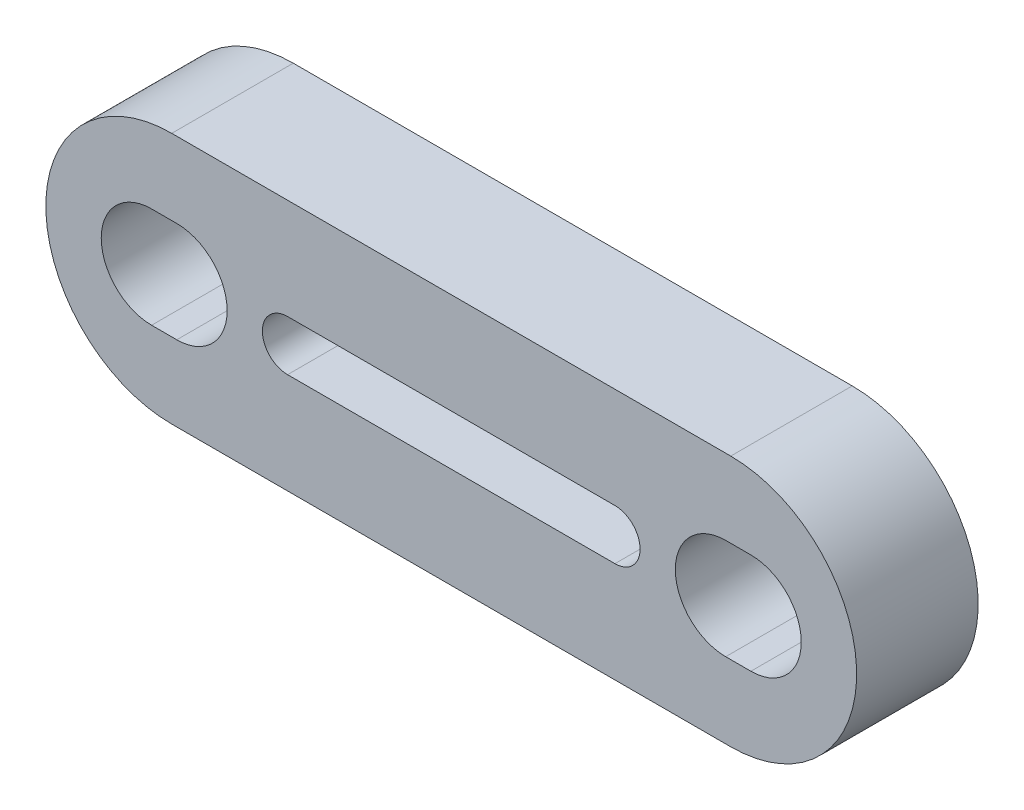
ISO-10303-21;
HEADER;
FILE_DESCRIPTION(('STEP AP214'),'2;1');
FILE_NAME('part.step','',(''),(''),'','','');
FILE_SCHEMA(('AUTOMOTIVE_DESIGN { 1 0 10303 214 1 1 1 1 }'));
ENDSEC;
DATA;
#1=APPLICATION_CONTEXT('core data for automotive mechanical design processes');
#2=APPLICATION_PROTOCOL_DEFINITION('international standard','automotive_design',2000,#1);
#3=PRODUCT_CONTEXT('',#1,'mechanical');
#4=PRODUCT('Part','Part','',(#3));
#5=PRODUCT_RELATED_PRODUCT_CATEGORY('part','',(#4));
#6=PRODUCT_DEFINITION_FORMATION('','',#4);
#7=PRODUCT_DEFINITION_CONTEXT('part definition',#1,'design');
#8=PRODUCT_DEFINITION('design','',#6,#7);
#9=PRODUCT_DEFINITION_SHAPE('','',#8);
#10=(LENGTH_UNIT() NAMED_UNIT(*) SI_UNIT(.MILLI.,.METRE.));
#11=(NAMED_UNIT(*) PLANE_ANGLE_UNIT() SI_UNIT($,.RADIAN.));
#12=(NAMED_UNIT(*) SI_UNIT($,.STERADIAN.) SOLID_ANGLE_UNIT());
#13=UNCERTAINTY_MEASURE_WITH_UNIT(LENGTH_MEASURE(1.E-05),#10,'distance_accuracy_value','');
#14=(GEOMETRIC_REPRESENTATION_CONTEXT(3) GLOBAL_UNCERTAINTY_ASSIGNED_CONTEXT((#13)) GLOBAL_UNIT_ASSIGNED_CONTEXT((#10,
#11,#12)) REPRESENTATION_CONTEXT('',''));
#15=CARTESIAN_POINT('',(0.,0.,0.));
#16=DIRECTION('',(0.,0.,1.));
#17=DIRECTION('',(1.,0.,0.));
#18=AXIS2_PLACEMENT_3D('',#15,#16,#17);
#19=CARTESIAN_POINT('',(0.,-5.,-1.651));
#20=DIRECTION('',(0.,-1.,0.));
#21=DIRECTION('',(0.,0.,-1.));
#22=AXIS2_PLACEMENT_3D('',#19,#20,#21);
#23=PLANE('',#22);
#24=DIRECTION('',(0.,0.,1.));
#25=VECTOR('',#24,1.);
#26=CARTESIAN_POINT('',(23.,-5.,-1.651));
#27=LINE('',#26,#25);
#28=CARTESIAN_POINT('',(23.,-5.,-1.651));
#29=VERTEX_POINT('',#28);
#30=CARTESIAN_POINT('',(23.,-5.,3.175));
#31=VERTEX_POINT('',#30);
#32=EDGE_CURVE('E251',#29,#31,#27,.T.);
#33=ORIENTED_EDGE('',*,*,#32,.T.);
#34=DIRECTION('',(1.,0.,0.));
#35=VECTOR('',#34,1.);
#36=CARTESIAN_POINT('',(0.,-5.,3.175));
#37=LINE('',#36,#35);
#38=CARTESIAN_POINT('',(0.799999999999999,-5.,3.175));
#39=VERTEX_POINT('',#38);
#40=EDGE_CURVE('E203',#39,#31,#37,.T.);
#41=ORIENTED_EDGE('',*,*,#40,.F.);
#42=DIRECTION('',(0.,0.,1.));
#43=VECTOR('',#42,1.);
#44=CARTESIAN_POINT('',(0.799999999999999,-5.,-1.651));
#45=LINE('',#44,#43);
#46=CARTESIAN_POINT('',(0.799999999999999,-5.,-1.651));
#47=VERTEX_POINT('',#46);
#48=EDGE_CURVE('E11',#47,#39,#45,.T.);
#49=ORIENTED_EDGE('',*,*,#48,.F.);
#50=DIRECTION('',(1.,0.,0.));
#51=VECTOR('',#50,1.);
#52=CARTESIAN_POINT('',(0.,-5.,-1.651));
#53=LINE('',#52,#51);
#54=EDGE_CURVE('E241',#47,#29,#53,.T.);
#55=ORIENTED_EDGE('',*,*,#54,.T.);
#56=EDGE_LOOP('',(#33,#41,#49,#55));
#57=FACE_BOUND('',#56,.T.);
#58=ADVANCED_FACE('F37',(#57),#23,.T.);
#59=CARTESIAN_POINT('',(0.799999999999999,0.,-1.651));
#60=DIRECTION('',(0.,0.,1.));
#61=DIRECTION('',(1.,0.,0.));
#62=AXIS2_PLACEMENT_3D('',#59,#60,#61);
#63=CYLINDRICAL_SURFACE('',#62,5.);
#64=ORIENTED_EDGE('',*,*,#48,.T.);
#65=CARTESIAN_POINT('',(0.799999999999999,0.,3.175));
#66=DIRECTION('',(0.,0.,1.));
#67=DIRECTION('',(1.,0.,0.));
#68=AXIS2_PLACEMENT_3D('',#65,#66,#67);
#69=CIRCLE('',#68,5.);
#70=CARTESIAN_POINT('',(0.799999999999999,5.,3.175));
#71=VERTEX_POINT('',#70);
#72=EDGE_CURVE('E212',#39,#71,#69,.F.);
#73=ORIENTED_EDGE('',*,*,#72,.T.);
#74=DIRECTION('',(0.,0.,1.));
#75=VECTOR('',#74,1.);
#76=CARTESIAN_POINT('',(0.799999999999999,5.,-1.651));
#77=LINE('',#76,#75);
#78=CARTESIAN_POINT('',(0.799999999999999,5.,-1.651));
#79=VERTEX_POINT('',#78);
#80=EDGE_CURVE('E46',#79,#71,#77,.T.);
#81=ORIENTED_EDGE('',*,*,#80,.F.);
#82=CARTESIAN_POINT('',(0.799999999999999,0.,-1.651));
#83=DIRECTION('',(0.,0.,1.));
#84=DIRECTION('',(1.,0.,0.));
#85=AXIS2_PLACEMENT_3D('',#82,#83,#84);
#86=CIRCLE('',#85,5.);
#87=EDGE_CURVE('E160',#47,#79,#86,.F.);
#88=ORIENTED_EDGE('',*,*,#87,.F.);
#89=EDGE_LOOP('',(#64,#73,#81,#88));
#90=FACE_BOUND('',#89,.T.);
#91=ADVANCED_FACE('F301',(#90),#63,.T.);
#92=CARTESIAN_POINT('',(0.,5.,-1.651));
#93=DIRECTION('',(0.,-1.,0.));
#94=DIRECTION('',(0.,0.,-1.));
#95=AXIS2_PLACEMENT_3D('',#92,#93,#94);
#96=PLANE('',#95);
#97=ORIENTED_EDGE('',*,*,#80,.T.);
#98=DIRECTION('',(1.,0.,0.));
#99=VECTOR('',#98,1.);
#100=CARTESIAN_POINT('',(0.,5.,3.175));
#101=LINE('',#100,#99);
#102=CARTESIAN_POINT('',(23.,5.,3.175));
#103=VERTEX_POINT('',#102);
#104=EDGE_CURVE('E209',#71,#103,#101,.T.);
#105=ORIENTED_EDGE('',*,*,#104,.T.);
#106=DIRECTION('',(0.,0.,1.));
#107=VECTOR('',#106,1.);
#108=CARTESIAN_POINT('',(23.,5.,-1.651));
#109=LINE('',#108,#107);
#110=CARTESIAN_POINT('',(23.,5.,-1.651));
#111=VERTEX_POINT('',#110);
#112=EDGE_CURVE('E249',#111,#103,#109,.T.);
#113=ORIENTED_EDGE('',*,*,#112,.F.);
#114=DIRECTION('',(1.,0.,0.));
#115=VECTOR('',#114,1.);
#116=CARTESIAN_POINT('',(0.,5.,-1.651));
#117=LINE('',#116,#115);
#118=EDGE_CURVE('E60',#79,#111,#117,.T.);
#119=ORIENTED_EDGE('',*,*,#118,.F.);
#120=EDGE_LOOP('',(#97,#105,#113,#119));
#121=FACE_BOUND('',#120,.T.);
#122=ADVANCED_FACE('F302',(#121),#96,.F.);
#123=CARTESIAN_POINT('',(5.4,0.,-1.651));
#124=DIRECTION('',(0.,0.,1.));
#125=DIRECTION('',(1.,0.,0.));
#126=AXIS2_PLACEMENT_3D('',#123,#124,#125);
#127=CYLINDRICAL_SURFACE('',#126,0.999999999999997);
#128=DIRECTION('',(0.,0.,1.));
#129=VECTOR('',#128,1.);
#130=CARTESIAN_POINT('',(5.4,0.999999999999998,-1.651));
#131=LINE('',#130,#129);
#132=CARTESIAN_POINT('',(5.4,0.999999999999998,-1.651));
#133=VERTEX_POINT('',#132);
#134=CARTESIAN_POINT('',(5.4,0.999999999999998,3.175));
#135=VERTEX_POINT('',#134);
#136=EDGE_CURVE('E259',#133,#135,#131,.T.);
#137=ORIENTED_EDGE('',*,*,#136,.T.);
#138=CARTESIAN_POINT('',(5.4,0.,3.175));
#139=DIRECTION('',(0.,0.,1.));
#140=DIRECTION('',(1.,0.,0.));
#141=AXIS2_PLACEMENT_3D('',#138,#139,#140);
#142=CIRCLE('',#141,0.999999999999997);
#143=CARTESIAN_POINT('',(5.4,-0.999999999999997,3.175));
#144=VERTEX_POINT('',#143);
#145=EDGE_CURVE('E191',#135,#144,#142,.T.);
#146=ORIENTED_EDGE('',*,*,#145,.T.);
#147=DIRECTION('',(0.,0.,1.));
#148=VECTOR('',#147,1.);
#149=CARTESIAN_POINT('',(5.4,-0.999999999999997,-1.651));
#150=LINE('',#149,#148);
#151=CARTESIAN_POINT('',(5.4,-0.999999999999997,-1.651));
#152=VERTEX_POINT('',#151);
#153=EDGE_CURVE('E253',#152,#144,#150,.T.);
#154=ORIENTED_EDGE('',*,*,#153,.F.);
#155=CARTESIAN_POINT('',(5.4,0.,-1.651));
#156=DIRECTION('',(0.,0.,1.));
#157=DIRECTION('',(1.,0.,0.));
#158=AXIS2_PLACEMENT_3D('',#155,#156,#157);
#159=CIRCLE('',#158,0.999999999999997);
#160=EDGE_CURVE('E232',#133,#152,#159,.T.);
#161=ORIENTED_EDGE('',*,*,#160,.F.);
#162=EDGE_LOOP('',(#137,#146,#154,#161));
#163=FACE_BOUND('',#162,.T.);
#164=ADVANCED_FACE('F304',(#163),#127,.F.);
#165=CARTESIAN_POINT('',(0.,-0.999999999999997,-1.651));
#166=DIRECTION('',(0.,1.,0.));
#167=DIRECTION('',(0.,0.,1.));
#168=AXIS2_PLACEMENT_3D('',#165,#166,#167);
#169=PLANE('',#168);
#170=ORIENTED_EDGE('',*,*,#153,.T.);
#171=DIRECTION('',(-1.,0.,0.));
#172=VECTOR('',#171,1.);
#173=CARTESIAN_POINT('',(0.,-0.999999999999997,3.175));
#174=LINE('',#173,#172);
#175=CARTESIAN_POINT('',(18.4,-0.999999999999997,3.175));
#176=VERTEX_POINT('',#175);
#177=EDGE_CURVE('E200',#176,#144,#174,.T.);
#178=ORIENTED_EDGE('',*,*,#177,.F.);
#179=DIRECTION('',(0.,0.,1.));
#180=VECTOR('',#179,1.);
#181=CARTESIAN_POINT('',(18.4,-0.999999999999997,-1.651));
#182=LINE('',#181,#180);
#183=CARTESIAN_POINT('',(18.4,-0.999999999999997,-1.651));
#184=VERTEX_POINT('',#183);
#185=EDGE_CURVE('E255',#184,#176,#182,.T.);
#186=ORIENTED_EDGE('',*,*,#185,.F.);
#187=DIRECTION('',(-1.,0.,0.));
#188=VECTOR('',#187,1.);
#189=CARTESIAN_POINT('',(0.,-0.999999999999997,-1.651));
#190=LINE('',#189,#188);
#191=EDGE_CURVE('E238',#184,#152,#190,.T.);
#192=ORIENTED_EDGE('',*,*,#191,.T.);
#193=EDGE_LOOP('',(#170,#178,#186,#192));
#194=FACE_BOUND('',#193,.T.);
#195=ADVANCED_FACE('F310',(#194),#169,.T.);
#196=CARTESIAN_POINT('',(18.4,0.,-1.651));
#197=DIRECTION('',(0.,0.,1.));
#198=DIRECTION('',(1.,0.,0.));
#199=AXIS2_PLACEMENT_3D('',#196,#197,#198);
#200=CYLINDRICAL_SURFACE('',#199,0.999999999999997);
#201=ORIENTED_EDGE('',*,*,#185,.T.);
#202=CARTESIAN_POINT('',(18.4,0.,3.175));
#203=DIRECTION('',(0.,0.,1.));
#204=DIRECTION('',(1.,0.,0.));
#205=AXIS2_PLACEMENT_3D('',#202,#203,#204);
#206=CIRCLE('',#205,0.999999999999997);
#207=CARTESIAN_POINT('',(18.4,0.999999999999999,3.175));
#208=VERTEX_POINT('',#207);
#209=EDGE_CURVE('E197',#176,#208,#206,.T.);
#210=ORIENTED_EDGE('',*,*,#209,.T.);
#211=DIRECTION('',(0.,0.,1.));
#212=VECTOR('',#211,1.);
#213=CARTESIAN_POINT('',(18.4,0.999999999999999,-1.651));
#214=LINE('',#213,#212);
#215=CARTESIAN_POINT('',(18.4,0.999999999999999,-1.651));
#216=VERTEX_POINT('',#215);
#217=EDGE_CURVE('E257',#216,#208,#214,.T.);
#218=ORIENTED_EDGE('',*,*,#217,.F.);
#219=CARTESIAN_POINT('',(18.4,0.,-1.651));
#220=DIRECTION('',(0.,0.,1.));
#221=DIRECTION('',(1.,0.,0.));
#222=AXIS2_PLACEMENT_3D('',#219,#220,#221);
#223=CIRCLE('',#222,0.999999999999997);
#224=EDGE_CURVE('E236',#184,#216,#223,.T.);
#225=ORIENTED_EDGE('',*,*,#224,.F.);
#226=EDGE_LOOP('',(#201,#210,#218,#225));
#227=FACE_BOUND('',#226,.T.);
#228=ADVANCED_FACE('F322',(#227),#200,.F.);
#229=CARTESIAN_POINT('',(23.8,0.,-1.651));
#230=DIRECTION('',(0.,0.,1.));
#231=DIRECTION('',(1.,0.,0.));
#232=AXIS2_PLACEMENT_3D('',#229,#230,#231);
#233=CYLINDRICAL_SURFACE('',#232,2.);
#234=DIRECTION('',(0.,0.,1.));
#235=VECTOR('',#234,1.);
#236=CARTESIAN_POINT('',(23.8,-2.,-1.651));
#237=LINE('',#236,#235);
#238=CARTESIAN_POINT('',(23.8,-2.,-1.651));
#239=VERTEX_POINT('',#238);
#240=CARTESIAN_POINT('',(23.8,-2.,3.175));
#241=VERTEX_POINT('',#240);
#242=EDGE_CURVE('E267',#239,#241,#237,.T.);
#243=ORIENTED_EDGE('',*,*,#242,.T.);
#244=CARTESIAN_POINT('',(23.8,0.,3.175));
#245=DIRECTION('',(0.,0.,1.));
#246=DIRECTION('',(1.,0.,0.));
#247=AXIS2_PLACEMENT_3D('',#244,#245,#246);
#248=CIRCLE('',#247,2.);
#249=CARTESIAN_POINT('',(23.8,2.,3.175));
#250=VERTEX_POINT('',#249);
#251=EDGE_CURVE('E179',#241,#250,#248,.T.);
#252=ORIENTED_EDGE('',*,*,#251,.T.);
#253=DIRECTION('',(0.,0.,1.));
#254=VECTOR('',#253,1.);
#255=CARTESIAN_POINT('',(23.8,2.,-1.651));
#256=LINE('',#255,#254);
#257=CARTESIAN_POINT('',(23.8,2.,-1.651));
#258=VERTEX_POINT('',#257);
#259=EDGE_CURVE('E261',#258,#250,#256,.T.);
#260=ORIENTED_EDGE('',*,*,#259,.F.);
#261=CARTESIAN_POINT('',(23.8,0.,-1.651));
#262=DIRECTION('',(0.,0.,1.));
#263=DIRECTION('',(1.,0.,0.));
#264=AXIS2_PLACEMENT_3D('',#261,#262,#263);
#265=CIRCLE('',#264,2.);
#266=EDGE_CURVE('E223',#239,#258,#265,.T.);
#267=ORIENTED_EDGE('',*,*,#266,.F.);
#268=EDGE_LOOP('',(#243,#252,#260,#267));
#269=FACE_BOUND('',#268,.T.);
#270=ADVANCED_FACE('F326',(#269),#233,.F.);
#271=CARTESIAN_POINT('',(0.,2.,-1.651));
#272=DIRECTION('',(0.,-1.,0.));
#273=DIRECTION('',(0.,0.,-1.));
#274=AXIS2_PLACEMENT_3D('',#271,#272,#273);
#275=PLANE('',#274);
#276=ORIENTED_EDGE('',*,*,#259,.T.);
#277=DIRECTION('',(1.,0.,0.));
#278=VECTOR('',#277,1.);
#279=CARTESIAN_POINT('',(0.,2.,3.175));
#280=LINE('',#279,#278);
#281=CARTESIAN_POINT('',(22.8,2.,3.175));
#282=VERTEX_POINT('',#281);
#283=EDGE_CURVE('E188',#282,#250,#280,.T.);
#284=ORIENTED_EDGE('',*,*,#283,.F.);
#285=DIRECTION('',(0.,0.,1.));
#286=VECTOR('',#285,1.);
#287=CARTESIAN_POINT('',(22.8,2.,-1.651));
#288=LINE('',#287,#286);
#289=CARTESIAN_POINT('',(22.8,2.,-1.651));
#290=VERTEX_POINT('',#289);
#291=EDGE_CURVE('E263',#290,#282,#288,.T.);
#292=ORIENTED_EDGE('',*,*,#291,.F.);
#293=DIRECTION('',(1.,0.,0.));
#294=VECTOR('',#293,1.);
#295=CARTESIAN_POINT('',(0.,2.,-1.651));
#296=LINE('',#295,#294);
#297=EDGE_CURVE('E229',#290,#258,#296,.T.);
#298=ORIENTED_EDGE('',*,*,#297,.T.);
#299=EDGE_LOOP('',(#276,#284,#292,#298));
#300=FACE_BOUND('',#299,.T.);
#301=ADVANCED_FACE('F333',(#300),#275,.T.);
#302=CARTESIAN_POINT('',(22.8,0.,-1.651));
#303=DIRECTION('',(0.,0.,1.));
#304=DIRECTION('',(1.,0.,0.));
#305=AXIS2_PLACEMENT_3D('',#302,#303,#304);
#306=CYLINDRICAL_SURFACE('',#305,2.);
#307=ORIENTED_EDGE('',*,*,#291,.T.);
#308=CARTESIAN_POINT('',(22.8,0.,3.175));
#309=DIRECTION('',(0.,0.,1.));
#310=DIRECTION('',(1.,0.,0.));
#311=AXIS2_PLACEMENT_3D('',#308,#309,#310);
#312=CIRCLE('',#311,2.);
#313=CARTESIAN_POINT('',(22.8,-2.,3.175));
#314=VERTEX_POINT('',#313);
#315=EDGE_CURVE('E185',#282,#314,#312,.T.);
#316=ORIENTED_EDGE('',*,*,#315,.T.);
#317=DIRECTION('',(0.,0.,1.));
#318=VECTOR('',#317,1.);
#319=CARTESIAN_POINT('',(22.8,-2.,-1.651));
#320=LINE('',#319,#318);
#321=CARTESIAN_POINT('',(22.8,-2.,-1.651));
#322=VERTEX_POINT('',#321);
#323=EDGE_CURVE('E265',#322,#314,#320,.T.);
#324=ORIENTED_EDGE('',*,*,#323,.F.);
#325=CARTESIAN_POINT('',(22.8,0.,-1.651));
#326=DIRECTION('',(0.,0.,1.));
#327=DIRECTION('',(1.,0.,0.));
#328=AXIS2_PLACEMENT_3D('',#325,#326,#327);
#329=CIRCLE('',#328,2.);
#330=EDGE_CURVE('E227',#290,#322,#329,.T.);
#331=ORIENTED_EDGE('',*,*,#330,.F.);
#332=EDGE_LOOP('',(#307,#316,#324,#331));
#333=FACE_BOUND('',#332,.T.);
#334=ADVANCED_FACE('F336',(#333),#306,.F.);
#335=CARTESIAN_POINT('',(1.,0.,-1.651));
#336=DIRECTION('',(0.,0.,1.));
#337=DIRECTION('',(1.,0.,0.));
#338=AXIS2_PLACEMENT_3D('',#335,#336,#337);
#339=CYLINDRICAL_SURFACE('',#338,2.);
#340=DIRECTION('',(0.,0.,1.));
#341=VECTOR('',#340,1.);
#342=CARTESIAN_POINT('',(1.,-2.,-1.651));
#343=LINE('',#342,#341);
#344=CARTESIAN_POINT('',(1.,-2.,-1.651));
#345=VERTEX_POINT('',#344);
#346=CARTESIAN_POINT('',(1.,-2.,3.175));
#347=VERTEX_POINT('',#346);
#348=EDGE_CURVE('E41',#345,#347,#343,.T.);
#349=ORIENTED_EDGE('',*,*,#348,.T.);
#350=CARTESIAN_POINT('',(1.,0.,3.175));
#351=DIRECTION('',(0.,0.,1.));
#352=DIRECTION('',(1.,0.,0.));
#353=AXIS2_PLACEMENT_3D('',#350,#351,#352);
#354=CIRCLE('',#353,2.);
#355=CARTESIAN_POINT('',(1.,2.,3.175));
#356=VERTEX_POINT('',#355);
#357=EDGE_CURVE('E154',#347,#356,#354,.T.);
#358=ORIENTED_EDGE('',*,*,#357,.T.);
#359=DIRECTION('',(0.,0.,1.));
#360=VECTOR('',#359,1.);
#361=CARTESIAN_POINT('',(1.,2.,-1.651));
#362=LINE('',#361,#360);
#363=CARTESIAN_POINT('',(1.,2.,-1.651));
#364=VERTEX_POINT('',#363);
#365=EDGE_CURVE('E269',#364,#356,#362,.T.);
#366=ORIENTED_EDGE('',*,*,#365,.F.);
#367=CARTESIAN_POINT('',(1.,0.,-1.651));
#368=DIRECTION('',(0.,0.,1.));
#369=DIRECTION('',(1.,0.,0.));
#370=AXIS2_PLACEMENT_3D('',#367,#368,#369);
#371=CIRCLE('',#370,2.);
#372=EDGE_CURVE('E155',#345,#364,#371,.T.);
#373=ORIENTED_EDGE('',*,*,#372,.F.);
#374=EDGE_LOOP('',(#349,#358,#366,#373));
#375=FACE_BOUND('',#374,.T.);
#376=ADVANCED_FACE('F39',(#375),#339,.F.);
#377=CARTESIAN_POINT('',(0.,2.,-1.651));
#378=DIRECTION('',(0.,-1.,0.));
#379=DIRECTION('',(0.,0.,-1.));
#380=AXIS2_PLACEMENT_3D('',#377,#378,#379);
#381=PLANE('',#380);
#382=ORIENTED_EDGE('',*,*,#365,.T.);
#383=DIRECTION('',(1.,0.,0.));
#384=VECTOR('',#383,1.);
#385=CARTESIAN_POINT('',(0.,2.,3.175));
#386=LINE('',#385,#384);
#387=CARTESIAN_POINT('',(0.,2.,3.175));
#388=VERTEX_POINT('',#387);
#389=EDGE_CURVE('E170',#388,#356,#386,.T.);
#390=ORIENTED_EDGE('',*,*,#389,.F.);
#391=DIRECTION('',(0.,0.,1.));
#392=VECTOR('',#391,1.);
#393=CARTESIAN_POINT('',(0.,2.,-1.651));
#394=LINE('',#393,#392);
#395=CARTESIAN_POINT('',(0.,2.,-1.651));
#396=VERTEX_POINT('',#395);
#397=EDGE_CURVE('E271',#396,#388,#394,.T.);
#398=ORIENTED_EDGE('',*,*,#397,.F.);
#399=DIRECTION('',(1.,0.,0.));
#400=VECTOR('',#399,1.);
#401=CARTESIAN_POINT('',(0.,2.,-1.651));
#402=LINE('',#401,#400);
#403=EDGE_CURVE('E220',#396,#364,#402,.T.);
#404=ORIENTED_EDGE('',*,*,#403,.T.);
#405=EDGE_LOOP('',(#382,#390,#398,#404));
#406=FACE_BOUND('',#405,.T.);
#407=ADVANCED_FACE('F277',(#406),#381,.T.);
#408=CARTESIAN_POINT('',(0.,0.,-1.651));
#409=DIRECTION('',(0.,0.,1.));
#410=DIRECTION('',(1.,0.,0.));
#411=AXIS2_PLACEMENT_3D('',#408,#409,#410);
#412=CYLINDRICAL_SURFACE('',#411,2.);
#413=ORIENTED_EDGE('',*,*,#397,.T.);
#414=CARTESIAN_POINT('',(0.,0.,3.175));
#415=DIRECTION('',(0.,0.,1.));
#416=DIRECTION('',(1.,0.,0.));
#417=AXIS2_PLACEMENT_3D('',#414,#415,#416);
#418=CIRCLE('',#417,2.);
#419=CARTESIAN_POINT('',(0.,-2.,3.175));
#420=VERTEX_POINT('',#419);
#421=EDGE_CURVE('E174',#388,#420,#418,.T.);
#422=ORIENTED_EDGE('',*,*,#421,.T.);
#423=DIRECTION('',(0.,0.,1.));
#424=VECTOR('',#423,1.);
#425=CARTESIAN_POINT('',(0.,-2.,-1.651));
#426=LINE('',#425,#424);
#427=CARTESIAN_POINT('',(0.,-2.,-1.651));
#428=VERTEX_POINT('',#427);
#429=EDGE_CURVE('E159',#428,#420,#426,.T.);
#430=ORIENTED_EDGE('',*,*,#429,.F.);
#431=CARTESIAN_POINT('',(0.,0.,-1.651));
#432=DIRECTION('',(0.,0.,1.));
#433=DIRECTION('',(1.,0.,0.));
#434=AXIS2_PLACEMENT_3D('',#431,#432,#433);
#435=CIRCLE('',#434,2.);
#436=EDGE_CURVE('E218',#396,#428,#435,.T.);
#437=ORIENTED_EDGE('',*,*,#436,.F.);
#438=EDGE_LOOP('',(#413,#422,#430,#437));
#439=FACE_BOUND('',#438,.T.);
#440=ADVANCED_FACE('F274',(#439),#412,.F.);
#441=CARTESIAN_POINT('',(0.,0.999999999999998,-1.651));
#442=DIRECTION('',(0.,1.,0.));
#443=DIRECTION('',(-1.,0.,0.));
#444=AXIS2_PLACEMENT_3D('',#441,#442,#443);
#445=PLANE('',#444);
#446=ORIENTED_EDGE('',*,*,#217,.T.);
#447=DIRECTION('',(-1.,0.,0.));
#448=VECTOR('',#447,1.);
#449=CARTESIAN_POINT('',(0.,0.999999999999998,3.175));
#450=LINE('',#449,#448);
#451=EDGE_CURVE('E194',#208,#135,#450,.T.);
#452=ORIENTED_EDGE('',*,*,#451,.T.);
#453=ORIENTED_EDGE('',*,*,#136,.F.);
#454=DIRECTION('',(-1.,0.,0.));
#455=VECTOR('',#454,1.);
#456=CARTESIAN_POINT('',(0.,0.999999999999998,-1.651));
#457=LINE('',#456,#455);
#458=EDGE_CURVE('E234',#216,#133,#457,.T.);
#459=ORIENTED_EDGE('',*,*,#458,.F.);
#460=EDGE_LOOP('',(#446,#452,#453,#459));
#461=FACE_BOUND('',#460,.T.);
#462=ADVANCED_FACE('F328',(#461),#445,.F.);
#463=CARTESIAN_POINT('',(0.,-2.,-1.651));
#464=DIRECTION('',(0.,-1.,0.));
#465=DIRECTION('',(0.,0.,-1.));
#466=AXIS2_PLACEMENT_3D('',#463,#464,#465);
#467=PLANE('',#466);
#468=ORIENTED_EDGE('',*,*,#323,.T.);
#469=DIRECTION('',(1.,0.,0.));
#470=VECTOR('',#469,1.);
#471=CARTESIAN_POINT('',(0.,-2.,3.175));
#472=LINE('',#471,#470);
#473=EDGE_CURVE('E182',#314,#241,#472,.T.);
#474=ORIENTED_EDGE('',*,*,#473,.T.);
#475=ORIENTED_EDGE('',*,*,#242,.F.);
#476=DIRECTION('',(1.,0.,0.));
#477=VECTOR('',#476,1.);
#478=CARTESIAN_POINT('',(0.,-2.,-1.651));
#479=LINE('',#478,#477);
#480=EDGE_CURVE('E225',#322,#239,#479,.T.);
#481=ORIENTED_EDGE('',*,*,#480,.F.);
#482=EDGE_LOOP('',(#468,#474,#475,#481));
#483=FACE_BOUND('',#482,.T.);
#484=ADVANCED_FACE('F330',(#483),#467,.F.);
#485=CARTESIAN_POINT('',(0.,-2.,-1.651));
#486=DIRECTION('',(0.,-1.,0.));
#487=DIRECTION('',(0.,0.,-1.));
#488=AXIS2_PLACEMENT_3D('',#485,#486,#487);
#489=PLANE('',#488);
#490=ORIENTED_EDGE('',*,*,#429,.T.);
#491=DIRECTION('',(1.,0.,0.));
#492=VECTOR('',#491,1.);
#493=CARTESIAN_POINT('',(0.,-2.,3.175));
#494=LINE('',#493,#492);
#495=EDGE_CURVE('E167',#420,#347,#494,.T.);
#496=ORIENTED_EDGE('',*,*,#495,.T.);
#497=ORIENTED_EDGE('',*,*,#348,.F.);
#498=DIRECTION('',(1.,0.,0.));
#499=VECTOR('',#498,1.);
#500=CARTESIAN_POINT('',(0.,-2.,-1.651));
#501=LINE('',#500,#499);
#502=EDGE_CURVE('E216',#428,#345,#501,.T.);
#503=ORIENTED_EDGE('',*,*,#502,.F.);
#504=EDGE_LOOP('',(#490,#496,#497,#503));
#505=FACE_BOUND('',#504,.T.);
#506=ADVANCED_FACE('F172',(#505),#489,.F.);
#507=CARTESIAN_POINT('',(23.,0.,-1.651));
#508=DIRECTION('',(0.,0.,1.));
#509=DIRECTION('',(1.,0.,0.));
#510=AXIS2_PLACEMENT_3D('',#507,#508,#509);
#511=CYLINDRICAL_SURFACE('',#510,5.);
#512=ORIENTED_EDGE('',*,*,#112,.T.);
#513=CARTESIAN_POINT('',(23.,0.,3.175));
#514=DIRECTION('',(0.,0.,1.));
#515=DIRECTION('',(1.,0.,0.));
#516=AXIS2_PLACEMENT_3D('',#513,#514,#515);
#517=CIRCLE('',#516,5.);
#518=EDGE_CURVE('E206',#31,#103,#517,.T.);
#519=ORIENTED_EDGE('',*,*,#518,.F.);
#520=ORIENTED_EDGE('',*,*,#32,.F.);
#521=CARTESIAN_POINT('',(23.,0.,-1.651));
#522=DIRECTION('',(0.,0.,1.));
#523=DIRECTION('',(1.,0.,0.));
#524=AXIS2_PLACEMENT_3D('',#521,#522,#523);
#525=CIRCLE('',#524,5.);
#526=EDGE_CURVE('E243',#29,#111,#525,.T.);
#527=ORIENTED_EDGE('',*,*,#526,.T.);
#528=EDGE_LOOP('',(#512,#519,#520,#527));
#529=FACE_BOUND('',#528,.T.);
#530=ADVANCED_FACE('F282',(#529),#511,.T.);
#531=CARTESIAN_POINT('',(0.,0.,-1.651));
#532=DIRECTION('',(0.,0.,1.));
#533=DIRECTION('',(1.,0.,0.));
#534=AXIS2_PLACEMENT_3D('',#531,#532,#533);
#535=PLANE('',#534);
#536=ORIENTED_EDGE('',*,*,#372,.T.);
#537=ORIENTED_EDGE('',*,*,#403,.F.);
#538=ORIENTED_EDGE('',*,*,#436,.T.);
#539=ORIENTED_EDGE('',*,*,#502,.T.);
#540=EDGE_LOOP('',(#536,#537,#538,#539));
#541=FACE_BOUND('',#540,.T.);
#542=ORIENTED_EDGE('',*,*,#266,.T.);
#543=ORIENTED_EDGE('',*,*,#297,.F.);
#544=ORIENTED_EDGE('',*,*,#330,.T.);
#545=ORIENTED_EDGE('',*,*,#480,.T.);
#546=EDGE_LOOP('',(#542,#543,#544,#545));
#547=FACE_BOUND('',#546,.T.);
#548=ORIENTED_EDGE('',*,*,#160,.T.);
#549=ORIENTED_EDGE('',*,*,#191,.F.);
#550=ORIENTED_EDGE('',*,*,#224,.T.);
#551=ORIENTED_EDGE('',*,*,#458,.T.);
#552=EDGE_LOOP('',(#548,#549,#550,#551));
#553=FACE_BOUND('',#552,.T.);
#554=ORIENTED_EDGE('',*,*,#54,.F.);
#555=ORIENTED_EDGE('',*,*,#87,.T.);
#556=ORIENTED_EDGE('',*,*,#118,.T.);
#557=ORIENTED_EDGE('',*,*,#526,.F.);
#558=EDGE_LOOP('',(#554,#555,#556,#557));
#559=FACE_BOUND('',#558,.T.);
#560=ADVANCED_FACE('F279',(#541,#547,#553,#559),#535,.F.);
#561=CARTESIAN_POINT('',(0.,0.,3.175));
#562=DIRECTION('',(0.,0.,1.));
#563=DIRECTION('',(1.,0.,0.));
#564=AXIS2_PLACEMENT_3D('',#561,#562,#563);
#565=PLANE('',#564);
#566=ORIENTED_EDGE('',*,*,#357,.F.);
#567=ORIENTED_EDGE('',*,*,#495,.F.);
#568=ORIENTED_EDGE('',*,*,#421,.F.);
#569=ORIENTED_EDGE('',*,*,#389,.T.);
#570=EDGE_LOOP('',(#566,#567,#568,#569));
#571=FACE_BOUND('',#570,.T.);
#572=ORIENTED_EDGE('',*,*,#251,.F.);
#573=ORIENTED_EDGE('',*,*,#473,.F.);
#574=ORIENTED_EDGE('',*,*,#315,.F.);
#575=ORIENTED_EDGE('',*,*,#283,.T.);
#576=EDGE_LOOP('',(#572,#573,#574,#575));
#577=FACE_BOUND('',#576,.T.);
#578=ORIENTED_EDGE('',*,*,#145,.F.);
#579=ORIENTED_EDGE('',*,*,#451,.F.);
#580=ORIENTED_EDGE('',*,*,#209,.F.);
#581=ORIENTED_EDGE('',*,*,#177,.T.);
#582=EDGE_LOOP('',(#578,#579,#580,#581));
#583=FACE_BOUND('',#582,.T.);
#584=ORIENTED_EDGE('',*,*,#40,.T.);
#585=ORIENTED_EDGE('',*,*,#518,.T.);
#586=ORIENTED_EDGE('',*,*,#104,.F.);
#587=ORIENTED_EDGE('',*,*,#72,.F.);
#588=EDGE_LOOP('',(#584,#585,#586,#587));
#589=FACE_BOUND('',#588,.T.);
#590=ADVANCED_FACE('F164',(#571,#577,#583,#589),#565,.T.);
#591=CLOSED_SHELL('',(#58,#91,#122,#164,#195,#228,#270,#301,#334,#376,#407,#440,#462,#484,#506,
#530,#560,#590));
#592=MANIFOLD_SOLID_BREP('B2',#591);
#593=ADVANCED_BREP_SHAPE_REPRESENTATION('',(#18,#592),#14);
#594=SHAPE_DEFINITION_REPRESENTATION(#9,#593);
ENDSEC;
END-ISO-10303-21;
